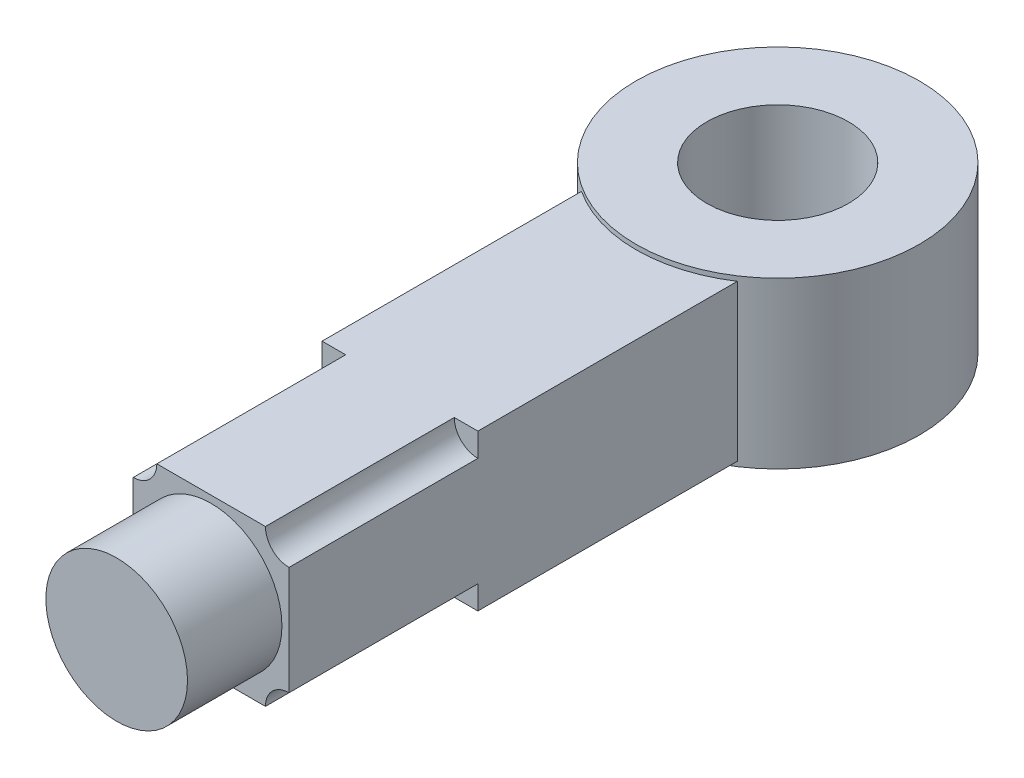
ISO-10303-21;
HEADER;
FILE_DESCRIPTION(('STEP AP214'),'2;1');
FILE_NAME('part.step','',(''),(''),'','','');
FILE_SCHEMA(('AUTOMOTIVE_DESIGN { 1 0 10303 214 1 1 1 1 }'));
ENDSEC;
DATA;
#1=APPLICATION_CONTEXT('core data for automotive mechanical design processes');
#2=APPLICATION_PROTOCOL_DEFINITION('international standard','automotive_design',2000,#1);
#3=PRODUCT_CONTEXT('',#1,'mechanical');
#4=PRODUCT('Part','Part','',(#3));
#5=PRODUCT_RELATED_PRODUCT_CATEGORY('part','',(#4));
#6=PRODUCT_DEFINITION_FORMATION('','',#4);
#7=PRODUCT_DEFINITION_CONTEXT('part definition',#1,'design');
#8=PRODUCT_DEFINITION('design','',#6,#7);
#9=PRODUCT_DEFINITION_SHAPE('','',#8);
#10=(LENGTH_UNIT() NAMED_UNIT(*) SI_UNIT(.MILLI.,.METRE.));
#11=(NAMED_UNIT(*) PLANE_ANGLE_UNIT() SI_UNIT($,.RADIAN.));
#12=(NAMED_UNIT(*) SI_UNIT($,.STERADIAN.) SOLID_ANGLE_UNIT());
#13=UNCERTAINTY_MEASURE_WITH_UNIT(LENGTH_MEASURE(1.E-05),#10,'distance_accuracy_value','');
#14=(GEOMETRIC_REPRESENTATION_CONTEXT(3) GLOBAL_UNCERTAINTY_ASSIGNED_CONTEXT((#13)) GLOBAL_UNIT_ASSIGNED_CONTEXT((#10,
#11,#12)) REPRESENTATION_CONTEXT('',''));
#15=CARTESIAN_POINT('',(0.,0.,0.));
#16=DIRECTION('',(0.,0.,1.));
#17=DIRECTION('',(1.,0.,0.));
#18=AXIS2_PLACEMENT_3D('',#15,#16,#17);
#19=CARTESIAN_POINT('',(16.5,16.5,120.));
#20=DIRECTION('',(-1.,0.,0.));
#21=DIRECTION('',(0.,0.,1.));
#22=AXIS2_PLACEMENT_3D('',#19,#20,#21);
#23=PLANE('',#22);
#24=DIRECTION('',(0.,0.,-1.));
#25=VECTOR('',#24,1.);
#26=CARTESIAN_POINT('',(16.5,-11.5000000000001,140.));
#27=LINE('',#26,#25);
#28=CARTESIAN_POINT('',(16.5,-11.5000000000001,120.));
#29=VERTEX_POINT('',#28);
#30=CARTESIAN_POINT('',(16.5,-11.5000000000001,80.));
#31=VERTEX_POINT('',#30);
#32=EDGE_CURVE('E136',#29,#31,#27,.T.);
#33=ORIENTED_EDGE('',*,*,#32,.T.);
#34=DIRECTION('',(0.,1.,0.));
#35=VECTOR('',#34,1.);
#36=CARTESIAN_POINT('',(16.4999999999999,-16.5000000000001,80.));
#37=LINE('',#36,#35);
#38=CARTESIAN_POINT('',(16.4999999999999,-16.5000000000001,80.));
#39=VERTEX_POINT('',#38);
#40=EDGE_CURVE('E142',#39,#31,#37,.T.);
#41=ORIENTED_EDGE('',*,*,#40,.F.);
#42=DIRECTION('',(0.,0.,-1.));
#43=VECTOR('',#42,1.);
#44=CARTESIAN_POINT('',(16.5,-16.5,120.));
#45=LINE('',#44,#43);
#46=CARTESIAN_POINT('',(16.5,-16.5,25.0549396327351));
#47=VERTEX_POINT('',#46);
#48=EDGE_CURVE('E237',#39,#47,#45,.T.);
#49=ORIENTED_EDGE('',*,*,#48,.T.);
#50=DIRECTION('',(0.,-1.,0.));
#51=VECTOR('',#50,1.);
#52=CARTESIAN_POINT('',(16.5,17.5,25.0549396327351));
#53=LINE('',#52,#51);
#54=CARTESIAN_POINT('',(16.5,16.5,25.0549396327351));
#55=VERTEX_POINT('',#54);
#56=EDGE_CURVE('E222',#47,#55,#53,.F.);
#57=ORIENTED_EDGE('',*,*,#56,.T.);
#58=DIRECTION('',(0.,0.,-1.));
#59=VECTOR('',#58,1.);
#60=CARTESIAN_POINT('',(16.5,16.5,120.));
#61=LINE('',#60,#59);
#62=CARTESIAN_POINT('',(16.5,16.5,80.));
#63=VERTEX_POINT('',#62);
#64=EDGE_CURVE('E246',#63,#55,#61,.T.);
#65=ORIENTED_EDGE('',*,*,#64,.F.);
#66=DIRECTION('',(0.,1.,0.));
#67=VECTOR('',#66,1.);
#68=CARTESIAN_POINT('',(16.5,11.5,80.));
#69=LINE('',#68,#67);
#70=CARTESIAN_POINT('',(16.5,11.5,80.));
#71=VERTEX_POINT('',#70);
#72=EDGE_CURVE('E203',#71,#63,#69,.T.);
#73=ORIENTED_EDGE('',*,*,#72,.F.);
#74=DIRECTION('',(0.,0.,-1.));
#75=VECTOR('',#74,1.);
#76=CARTESIAN_POINT('',(16.5,11.5,140.));
#77=LINE('',#76,#75);
#78=CARTESIAN_POINT('',(16.5,11.5,120.));
#79=VERTEX_POINT('',#78);
#80=EDGE_CURVE('E206',#79,#71,#77,.T.);
#81=ORIENTED_EDGE('',*,*,#80,.F.);
#82=DIRECTION('',(0.,1.,0.));
#83=VECTOR('',#82,1.);
#84=CARTESIAN_POINT('',(16.5,16.5,120.));
#85=LINE('',#84,#83);
#86=EDGE_CURVE('E153',#29,#79,#85,.T.);
#87=ORIENTED_EDGE('',*,*,#86,.F.);
#88=EDGE_LOOP('',(#33,#41,#49,#57,#65,#73,#81,#87));
#89=FACE_BOUND('',#88,.T.);
#90=ADVANCED_FACE('F45',(#89),#23,.F.);
#91=CARTESIAN_POINT('',(-16.5,16.5,120.));
#92=DIRECTION('',(0.,-1.,0.));
#93=DIRECTION('',(0.,0.,-1.));
#94=AXIS2_PLACEMENT_3D('',#91,#92,#93);
#95=PLANE('',#94);
#96=DIRECTION('',(0.,0.,-1.));
#97=VECTOR('',#96,1.);
#98=CARTESIAN_POINT('',(-11.4999999999998,16.5000000000001,140.));
#99=LINE('',#98,#97);
#100=CARTESIAN_POINT('',(-11.4999999999998,16.5000000000001,120.));
#101=VERTEX_POINT('',#100);
#102=CARTESIAN_POINT('',(-11.4999999999998,16.5000000000001,80.));
#103=VERTEX_POINT('',#102);
#104=EDGE_CURVE('E169',#101,#103,#99,.T.);
#105=ORIENTED_EDGE('',*,*,#104,.F.);
#106=DIRECTION('',(-1.,0.,0.));
#107=VECTOR('',#106,1.);
#108=CARTESIAN_POINT('',(-16.5,16.5,120.));
#109=LINE('',#108,#107);
#110=CARTESIAN_POINT('',(11.5,16.5,120.));
#111=VERTEX_POINT('',#110);
#112=EDGE_CURVE('E225',#111,#101,#109,.T.);
#113=ORIENTED_EDGE('',*,*,#112,.F.);
#114=DIRECTION('',(0.,0.,-1.));
#115=VECTOR('',#114,1.);
#116=CARTESIAN_POINT('',(11.5,16.5,140.));
#117=LINE('',#116,#115);
#118=CARTESIAN_POINT('',(11.5,16.5,80.));
#119=VERTEX_POINT('',#118);
#120=EDGE_CURVE('E209',#111,#119,#117,.T.);
#121=ORIENTED_EDGE('',*,*,#120,.T.);
#122=DIRECTION('',(-1.,0.,0.));
#123=VECTOR('',#122,1.);
#124=CARTESIAN_POINT('',(16.5,16.5,80.));
#125=LINE('',#124,#123);
#126=EDGE_CURVE('E195',#63,#119,#125,.T.);
#127=ORIENTED_EDGE('',*,*,#126,.F.);
#128=ORIENTED_EDGE('',*,*,#64,.T.);
#129=CARTESIAN_POINT('',(0.,16.5,0.));
#130=DIRECTION('',(0.,-1.,0.));
#131=DIRECTION('',(0.,0.,-1.));
#132=AXIS2_PLACEMENT_3D('',#129,#130,#131);
#133=CIRCLE('',#132,30.);
#134=CARTESIAN_POINT('',(-16.5,16.5,25.0549396327351));
#135=VERTEX_POINT('',#134);
#136=EDGE_CURVE('E265',#55,#135,#133,.T.);
#137=ORIENTED_EDGE('',*,*,#136,.T.);
#138=DIRECTION('',(0.,0.,-1.));
#139=VECTOR('',#138,1.);
#140=CARTESIAN_POINT('',(-16.5,16.5,120.));
#141=LINE('',#140,#139);
#142=CARTESIAN_POINT('',(-16.5,16.5,80.));
#143=VERTEX_POINT('',#142);
#144=EDGE_CURVE('E243',#143,#135,#141,.T.);
#145=ORIENTED_EDGE('',*,*,#144,.F.);
#146=DIRECTION('',(-1.,0.,0.));
#147=VECTOR('',#146,1.);
#148=CARTESIAN_POINT('',(-11.4999999999998,16.5000000000001,80.));
#149=LINE('',#148,#147);
#150=EDGE_CURVE('E61',#103,#143,#149,.T.);
#151=ORIENTED_EDGE('',*,*,#150,.F.);
#152=EDGE_LOOP('',(#105,#113,#121,#127,#128,#137,#145,#151));
#153=FACE_BOUND('',#152,.T.);
#154=ADVANCED_FACE('F298',(#153),#95,.F.);
#155=CARTESIAN_POINT('',(0.,0.,120.));
#156=DIRECTION('',(0.,0.,1.));
#157=DIRECTION('',(1.,0.,0.));
#158=AXIS2_PLACEMENT_3D('',#155,#156,#157);
#159=PLANE('',#158);
#160=CARTESIAN_POINT('',(0.,0.,120.));
#161=DIRECTION('',(0.,0.,1.));
#162=DIRECTION('',(1.,0.,0.));
#163=AXIS2_PLACEMENT_3D('',#160,#161,#162);
#164=CIRCLE('',#163,15.);
#165=CARTESIAN_POINT('',(15.,0.,120.));
#166=VERTEX_POINT('',#165);
#167=EDGE_CURVE('E217',#166,#166,#164,.T.);
#168=ORIENTED_EDGE('',*,*,#167,.F.);
#169=EDGE_LOOP('',(#168));
#170=FACE_BOUND('',#169,.T.);
#171=DIRECTION('',(1.,0.,0.));
#172=VECTOR('',#171,1.);
#173=CARTESIAN_POINT('',(-16.5,-16.5,120.));
#174=LINE('',#173,#172);
#175=CARTESIAN_POINT('',(-11.5,-16.5,120.));
#176=VERTEX_POINT('',#175);
#177=CARTESIAN_POINT('',(11.4999999999999,-16.5,120.));
#178=VERTEX_POINT('',#177);
#179=EDGE_CURVE('E233',#176,#178,#174,.T.);
#180=ORIENTED_EDGE('',*,*,#179,.T.);
#181=CARTESIAN_POINT('',(16.4999999999999,-16.5000000000001,120.));
#182=DIRECTION('',(0.,0.,1.));
#183=DIRECTION('',(1.,0.,0.));
#184=AXIS2_PLACEMENT_3D('',#181,#182,#183);
#185=CIRCLE('',#184,5.);
#186=EDGE_CURVE('E160',#178,#29,#185,.F.);
#187=ORIENTED_EDGE('',*,*,#186,.T.);
#188=ORIENTED_EDGE('',*,*,#86,.T.);
#189=CARTESIAN_POINT('',(16.5,16.5,120.));
#190=DIRECTION('',(0.,0.,1.));
#191=DIRECTION('',(1.,0.,0.));
#192=AXIS2_PLACEMENT_3D('',#189,#190,#191);
#193=CIRCLE('',#192,5.);
#194=EDGE_CURVE('E221',#79,#111,#193,.F.);
#195=ORIENTED_EDGE('',*,*,#194,.T.);
#196=ORIENTED_EDGE('',*,*,#112,.T.);
#197=CARTESIAN_POINT('',(-16.4999999999998,16.5000000000002,120.));
#198=DIRECTION('',(0.,0.,1.));
#199=DIRECTION('',(1.,0.,0.));
#200=AXIS2_PLACEMENT_3D('',#197,#198,#199);
#201=CIRCLE('',#200,5.);
#202=CARTESIAN_POINT('',(-16.4999999999999,11.5000000000002,120.));
#203=VERTEX_POINT('',#202);
#204=EDGE_CURVE('E191',#101,#203,#201,.F.);
#205=ORIENTED_EDGE('',*,*,#204,.T.);
#206=DIRECTION('',(0.,-1.,0.));
#207=VECTOR('',#206,1.);
#208=CARTESIAN_POINT('',(-16.5,16.5,120.));
#209=LINE('',#208,#207);
#210=CARTESIAN_POINT('',(-16.5,-11.5,120.));
#211=VERTEX_POINT('',#210);
#212=EDGE_CURVE('E229',#203,#211,#209,.T.);
#213=ORIENTED_EDGE('',*,*,#212,.T.);
#214=CARTESIAN_POINT('',(-16.5,-16.5,120.));
#215=DIRECTION('',(0.,0.,1.));
#216=DIRECTION('',(1.,0.,0.));
#217=AXIS2_PLACEMENT_3D('',#214,#215,#216);
#218=CIRCLE('',#217,5.);
#219=EDGE_CURVE('E155',#211,#176,#218,.F.);
#220=ORIENTED_EDGE('',*,*,#219,.T.);
#221=EDGE_LOOP('',(#180,#187,#188,#195,#196,#205,#213,#220));
#222=FACE_BOUND('',#221,.T.);
#223=ADVANCED_FACE('F286',(#170,#222),#159,.T.);
#224=CARTESIAN_POINT('',(-16.5,16.5,120.));
#225=DIRECTION('',(1.,0.,0.));
#226=DIRECTION('',(0.,0.,-1.));
#227=AXIS2_PLACEMENT_3D('',#224,#225,#226);
#228=PLANE('',#227);
#229=DIRECTION('',(0.,0.,-1.));
#230=VECTOR('',#229,1.);
#231=CARTESIAN_POINT('',(-16.5,-11.5,140.));
#232=LINE('',#231,#230);
#233=CARTESIAN_POINT('',(-16.5,-11.5,80.));
#234=VERTEX_POINT('',#233);
#235=EDGE_CURVE('E149',#211,#234,#232,.T.);
#236=ORIENTED_EDGE('',*,*,#235,.F.);
#237=ORIENTED_EDGE('',*,*,#212,.F.);
#238=DIRECTION('',(0.,0.,-1.));
#239=VECTOR('',#238,1.);
#240=CARTESIAN_POINT('',(-16.5,11.5000000000002,140.));
#241=LINE('',#240,#239);
#242=CARTESIAN_POINT('',(-16.4999999999999,11.5000000000002,80.));
#243=VERTEX_POINT('',#242);
#244=EDGE_CURVE('E11',#243,#203,#241,.F.);
#245=ORIENTED_EDGE('',*,*,#244,.F.);
#246=DIRECTION('',(0.,-1.,0.));
#247=VECTOR('',#246,1.);
#248=CARTESIAN_POINT('',(-16.4999999999998,16.5000000000002,80.));
#249=LINE('',#248,#247);
#250=EDGE_CURVE('E178',#143,#243,#249,.T.);
#251=ORIENTED_EDGE('',*,*,#250,.F.);
#252=ORIENTED_EDGE('',*,*,#144,.T.);
#253=DIRECTION('',(0.,-1.,0.));
#254=VECTOR('',#253,1.);
#255=CARTESIAN_POINT('',(-16.5,17.5,25.0549396327351));
#256=LINE('',#255,#254);
#257=CARTESIAN_POINT('',(-16.5,-16.5,25.0549396327351));
#258=VERTEX_POINT('',#257);
#259=EDGE_CURVE('E261',#135,#258,#256,.T.);
#260=ORIENTED_EDGE('',*,*,#259,.T.);
#261=DIRECTION('',(0.,0.,-1.));
#262=VECTOR('',#261,1.);
#263=CARTESIAN_POINT('',(-16.5,-16.5,120.));
#264=LINE('',#263,#262);
#265=CARTESIAN_POINT('',(-16.5,-16.5,80.));
#266=VERTEX_POINT('',#265);
#267=EDGE_CURVE('E240',#266,#258,#264,.T.);
#268=ORIENTED_EDGE('',*,*,#267,.F.);
#269=DIRECTION('',(0.,-1.,0.));
#270=VECTOR('',#269,1.);
#271=CARTESIAN_POINT('',(-16.5,-11.5,80.));
#272=LINE('',#271,#270);
#273=EDGE_CURVE('E173',#234,#266,#272,.T.);
#274=ORIENTED_EDGE('',*,*,#273,.F.);
#275=EDGE_LOOP('',(#236,#237,#245,#251,#252,#260,#268,#274));
#276=FACE_BOUND('',#275,.T.);
#277=ADVANCED_FACE('F312',(#276),#228,.F.);
#278=CARTESIAN_POINT('',(-16.5,-16.5,120.));
#279=DIRECTION('',(0.,1.,0.));
#280=DIRECTION('',(0.,0.,1.));
#281=AXIS2_PLACEMENT_3D('',#278,#279,#280);
#282=PLANE('',#281);
#283=DIRECTION('',(0.,0.,-1.));
#284=VECTOR('',#283,1.);
#285=CARTESIAN_POINT('',(11.4999999999999,-16.5,140.));
#286=LINE('',#285,#284);
#287=CARTESIAN_POINT('',(11.4999999999999,-16.5,80.));
#288=VERTEX_POINT('',#287);
#289=EDGE_CURVE('E54',#178,#288,#286,.T.);
#290=ORIENTED_EDGE('',*,*,#289,.F.);
#291=ORIENTED_EDGE('',*,*,#179,.F.);
#292=DIRECTION('',(0.,0.,-1.));
#293=VECTOR('',#292,1.);
#294=CARTESIAN_POINT('',(-11.5,-16.5,140.));
#295=LINE('',#294,#293);
#296=CARTESIAN_POINT('',(-11.5,-16.5,80.));
#297=VERTEX_POINT('',#296);
#298=EDGE_CURVE('E275',#297,#176,#295,.F.);
#299=ORIENTED_EDGE('',*,*,#298,.F.);
#300=DIRECTION('',(1.,0.,0.));
#301=VECTOR('',#300,1.);
#302=CARTESIAN_POINT('',(-16.5,-16.5,80.));
#303=LINE('',#302,#301);
#304=EDGE_CURVE('E164',#266,#297,#303,.T.);
#305=ORIENTED_EDGE('',*,*,#304,.F.);
#306=ORIENTED_EDGE('',*,*,#267,.T.);
#307=CARTESIAN_POINT('',(0.,-16.5,0.));
#308=DIRECTION('',(0.,1.,0.));
#309=DIRECTION('',(0.,0.,1.));
#310=AXIS2_PLACEMENT_3D('',#307,#308,#309);
#311=CIRCLE('',#310,30.);
#312=EDGE_CURVE('E254',#258,#47,#311,.T.);
#313=ORIENTED_EDGE('',*,*,#312,.T.);
#314=ORIENTED_EDGE('',*,*,#48,.F.);
#315=DIRECTION('',(1.,0.,0.));
#316=VECTOR('',#315,1.);
#317=CARTESIAN_POINT('',(11.4999999999999,-16.5,80.));
#318=LINE('',#317,#316);
#319=EDGE_CURVE('E141',#288,#39,#318,.T.);
#320=ORIENTED_EDGE('',*,*,#319,.F.);
#321=EDGE_LOOP('',(#290,#291,#299,#305,#306,#313,#314,#320));
#322=FACE_BOUND('',#321,.T.);
#323=ADVANCED_FACE('F288',(#322),#282,.F.);
#324=CARTESIAN_POINT('',(0.,17.5,0.));
#325=DIRECTION('',(0.,-1.,0.));
#326=DIRECTION('',(0.,0.,-1.));
#327=AXIS2_PLACEMENT_3D('',#324,#325,#326);
#328=CYLINDRICAL_SURFACE('',#327,30.);
#329=CARTESIAN_POINT('',(0.,-17.5,0.));
#330=DIRECTION('',(0.,1.,0.));
#331=DIRECTION('',(0.,0.,1.));
#332=AXIS2_PLACEMENT_3D('',#329,#330,#331);
#333=CIRCLE('',#332,30.);
#334=CARTESIAN_POINT('',(0.,-17.5,30.));
#335=VERTEX_POINT('',#334);
#336=EDGE_CURVE('E249',#335,#335,#333,.T.);
#337=ORIENTED_EDGE('',*,*,#336,.T.);
#338=EDGE_LOOP('',(#337));
#339=FACE_BOUND('',#338,.T.);
#340=CARTESIAN_POINT('',(0.,17.5,0.));
#341=DIRECTION('',(0.,1.,0.));
#342=DIRECTION('',(0.,0.,1.));
#343=AXIS2_PLACEMENT_3D('',#340,#341,#342);
#344=CIRCLE('',#343,30.);
#345=CARTESIAN_POINT('',(0.,17.5,30.));
#346=VERTEX_POINT('',#345);
#347=EDGE_CURVE('E250',#346,#346,#344,.T.);
#348=ORIENTED_EDGE('',*,*,#347,.F.);
#349=EDGE_LOOP('',(#348));
#350=FACE_BOUND('',#349,.T.);
#351=ORIENTED_EDGE('',*,*,#56,.F.);
#352=ORIENTED_EDGE('',*,*,#312,.F.);
#353=ORIENTED_EDGE('',*,*,#259,.F.);
#354=ORIENTED_EDGE('',*,*,#136,.F.);
#355=EDGE_LOOP('',(#351,#352,#353,#354));
#356=FACE_BOUND('',#355,.T.);
#357=ADVANCED_FACE('F47',(#339,#350,#356),#328,.T.);
#358=CARTESIAN_POINT('',(0.,17.5,0.));
#359=DIRECTION('',(0.,1.,0.));
#360=DIRECTION('',(0.,0.,1.));
#361=AXIS2_PLACEMENT_3D('',#358,#359,#360);
#362=PLANE('',#361);
#363=CARTESIAN_POINT('',(0.,17.5,0.));
#364=DIRECTION('',(0.,1.,0.));
#365=DIRECTION('',(0.,0.,1.));
#366=AXIS2_PLACEMENT_3D('',#363,#364,#365);
#367=CIRCLE('',#366,15.);
#368=CARTESIAN_POINT('',(0.,17.5,15.));
#369=VERTEX_POINT('',#368);
#370=EDGE_CURVE('E489',#369,#369,#367,.T.);
#371=ORIENTED_EDGE('',*,*,#370,.F.);
#372=EDGE_LOOP('',(#371));
#373=FACE_BOUND('',#372,.T.);
#374=ORIENTED_EDGE('',*,*,#347,.T.);
#375=EDGE_LOOP('',(#374));
#376=FACE_BOUND('',#375,.T.);
#377=ADVANCED_FACE('F334',(#373,#376),#362,.T.);
#378=CARTESIAN_POINT('',(0.,-17.5,0.));
#379=DIRECTION('',(0.,1.,0.));
#380=DIRECTION('',(0.,0.,1.));
#381=AXIS2_PLACEMENT_3D('',#378,#379,#380);
#382=PLANE('',#381);
#383=CARTESIAN_POINT('',(0.,-17.5,0.));
#384=DIRECTION('',(0.,1.,0.));
#385=DIRECTION('',(0.,0.,1.));
#386=AXIS2_PLACEMENT_3D('',#383,#384,#385);
#387=CIRCLE('',#386,15.);
#388=CARTESIAN_POINT('',(0.,-17.5,15.));
#389=VERTEX_POINT('',#388);
#390=EDGE_CURVE('E182',#389,#389,#387,.T.);
#391=ORIENTED_EDGE('',*,*,#390,.T.);
#392=EDGE_LOOP('',(#391));
#393=FACE_BOUND('',#392,.T.);
#394=ORIENTED_EDGE('',*,*,#336,.F.);
#395=EDGE_LOOP('',(#394));
#396=FACE_BOUND('',#395,.T.);
#397=ADVANCED_FACE('F336',(#393,#396),#382,.F.);
#398=CARTESIAN_POINT('',(0.,0.,140.));
#399=DIRECTION('',(0.,0.,-1.));
#400=DIRECTION('',(-1.,0.,0.));
#401=AXIS2_PLACEMENT_3D('',#398,#399,#400);
#402=CYLINDRICAL_SURFACE('',#401,15.);
#403=CARTESIAN_POINT('',(0.,0.,140.));
#404=DIRECTION('',(0.,0.,1.));
#405=DIRECTION('',(1.,0.,0.));
#406=AXIS2_PLACEMENT_3D('',#403,#404,#405);
#407=CIRCLE('',#406,15.);
#408=CARTESIAN_POINT('',(15.,0.,140.));
#409=VERTEX_POINT('',#408);
#410=EDGE_CURVE('E213',#409,#409,#407,.T.);
#411=ORIENTED_EDGE('',*,*,#410,.F.);
#412=EDGE_LOOP('',(#411));
#413=FACE_BOUND('',#412,.T.);
#414=ORIENTED_EDGE('',*,*,#167,.T.);
#415=EDGE_LOOP('',(#414));
#416=FACE_BOUND('',#415,.T.);
#417=ADVANCED_FACE('F339',(#413,#416),#402,.T.);
#418=CARTESIAN_POINT('',(0.,0.,140.));
#419=DIRECTION('',(0.,0.,1.));
#420=DIRECTION('',(1.,0.,0.));
#421=AXIS2_PLACEMENT_3D('',#418,#419,#420);
#422=PLANE('',#421);
#423=ORIENTED_EDGE('',*,*,#410,.T.);
#424=EDGE_LOOP('',(#423));
#425=FACE_BOUND('',#424,.T.);
#426=ADVANCED_FACE('F345',(#425),#422,.T.);
#427=CARTESIAN_POINT('',(16.5,16.5,140.));
#428=DIRECTION('',(0.,0.,-1.));
#429=DIRECTION('',(-1.,0.,0.));
#430=AXIS2_PLACEMENT_3D('',#427,#428,#429);
#431=CYLINDRICAL_SURFACE('',#430,5.);
#432=ORIENTED_EDGE('',*,*,#80,.T.);
#433=CARTESIAN_POINT('',(16.5,16.5,80.));
#434=DIRECTION('',(0.,0.,1.));
#435=DIRECTION('',(1.,0.,0.));
#436=AXIS2_PLACEMENT_3D('',#433,#434,#435);
#437=CIRCLE('',#436,5.);
#438=EDGE_CURVE('E199',#119,#71,#437,.T.);
#439=ORIENTED_EDGE('',*,*,#438,.F.);
#440=ORIENTED_EDGE('',*,*,#120,.F.);
#441=ORIENTED_EDGE('',*,*,#194,.F.);
#442=EDGE_LOOP('',(#432,#439,#440,#441));
#443=FACE_BOUND('',#442,.T.);
#444=ADVANCED_FACE('F304',(#443),#431,.F.);
#445=CARTESIAN_POINT('',(16.5,16.5,80.));
#446=DIRECTION('',(0.,0.,1.));
#447=DIRECTION('',(1.,0.,0.));
#448=AXIS2_PLACEMENT_3D('',#445,#446,#447);
#449=PLANE('',#448);
#450=ORIENTED_EDGE('',*,*,#126,.T.);
#451=ORIENTED_EDGE('',*,*,#438,.T.);
#452=ORIENTED_EDGE('',*,*,#72,.T.);
#453=EDGE_LOOP('',(#450,#451,#452));
#454=FACE_BOUND('',#453,.T.);
#455=ADVANCED_FACE('F302',(#454),#449,.T.);
#456=CARTESIAN_POINT('',(-16.5,-16.5,140.));
#457=DIRECTION('',(0.,0.,-1.));
#458=DIRECTION('',(-1.,0.,0.));
#459=AXIS2_PLACEMENT_3D('',#456,#457,#458);
#460=CYLINDRICAL_SURFACE('',#459,5.);
#461=ORIENTED_EDGE('',*,*,#235,.T.);
#462=CARTESIAN_POINT('',(-16.5,-16.5,80.));
#463=DIRECTION('',(0.,0.,1.));
#464=DIRECTION('',(-1.,0.,0.));
#465=AXIS2_PLACEMENT_3D('',#462,#463,#464);
#466=CIRCLE('',#465,5.);
#467=EDGE_CURVE('E168',#297,#234,#466,.T.);
#468=ORIENTED_EDGE('',*,*,#467,.F.);
#469=ORIENTED_EDGE('',*,*,#298,.T.);
#470=ORIENTED_EDGE('',*,*,#219,.F.);
#471=EDGE_LOOP('',(#461,#468,#469,#470));
#472=FACE_BOUND('',#471,.T.);
#473=ADVANCED_FACE('F280',(#472),#460,.F.);
#474=CARTESIAN_POINT('',(-16.5,-16.5,80.));
#475=DIRECTION('',(0.,0.,1.));
#476=DIRECTION('',(-1.,0.,0.));
#477=AXIS2_PLACEMENT_3D('',#474,#475,#476);
#478=PLANE('',#477);
#479=ORIENTED_EDGE('',*,*,#304,.T.);
#480=ORIENTED_EDGE('',*,*,#467,.T.);
#481=ORIENTED_EDGE('',*,*,#273,.T.);
#482=EDGE_LOOP('',(#479,#480,#481));
#483=FACE_BOUND('',#482,.T.);
#484=ADVANCED_FACE('F316',(#483),#478,.T.);
#485=CARTESIAN_POINT('',(16.4999999999999,-16.5000000000001,140.));
#486=DIRECTION('',(0.,0.,-1.));
#487=DIRECTION('',(-1.,0.,0.));
#488=AXIS2_PLACEMENT_3D('',#485,#486,#487);
#489=CYLINDRICAL_SURFACE('',#488,5.);
#490=ORIENTED_EDGE('',*,*,#289,.T.);
#491=CARTESIAN_POINT('',(16.4999999999999,-16.5000000000001,80.));
#492=DIRECTION('',(0.,0.,1.));
#493=DIRECTION('',(0.,-1.,0.));
#494=AXIS2_PLACEMENT_3D('',#491,#492,#493);
#495=CIRCLE('',#494,5.);
#496=EDGE_CURVE('E69',#31,#288,#495,.T.);
#497=ORIENTED_EDGE('',*,*,#496,.F.);
#498=ORIENTED_EDGE('',*,*,#32,.F.);
#499=ORIENTED_EDGE('',*,*,#186,.F.);
#500=EDGE_LOOP('',(#490,#497,#498,#499));
#501=FACE_BOUND('',#500,.T.);
#502=ADVANCED_FACE('F134',(#501),#489,.F.);
#503=CARTESIAN_POINT('',(16.4999999999999,-16.5000000000001,80.));
#504=DIRECTION('',(0.,0.,1.));
#505=DIRECTION('',(0.,-1.,0.));
#506=AXIS2_PLACEMENT_3D('',#503,#504,#505);
#507=PLANE('',#506);
#508=ORIENTED_EDGE('',*,*,#40,.T.);
#509=ORIENTED_EDGE('',*,*,#496,.T.);
#510=ORIENTED_EDGE('',*,*,#319,.T.);
#511=EDGE_LOOP('',(#508,#509,#510));
#512=FACE_BOUND('',#511,.T.);
#513=ADVANCED_FACE('F145',(#512),#507,.T.);
#514=CARTESIAN_POINT('',(-16.4999999999998,16.5000000000002,140.));
#515=DIRECTION('',(0.,0.,-1.));
#516=DIRECTION('',(-1.,0.,0.));
#517=AXIS2_PLACEMENT_3D('',#514,#515,#516);
#518=CYLINDRICAL_SURFACE('',#517,5.);
#519=ORIENTED_EDGE('',*,*,#104,.T.);
#520=CARTESIAN_POINT('',(-16.4999999999998,16.5000000000002,80.));
#521=DIRECTION('',(0.,0.,1.));
#522=DIRECTION('',(0.,1.,0.));
#523=AXIS2_PLACEMENT_3D('',#520,#521,#522);
#524=CIRCLE('',#523,5.);
#525=EDGE_CURVE('E181',#243,#103,#524,.T.);
#526=ORIENTED_EDGE('',*,*,#525,.F.);
#527=ORIENTED_EDGE('',*,*,#244,.T.);
#528=ORIENTED_EDGE('',*,*,#204,.F.);
#529=EDGE_LOOP('',(#519,#526,#527,#528));
#530=FACE_BOUND('',#529,.T.);
#531=ADVANCED_FACE('F308',(#530),#518,.F.);
#532=CARTESIAN_POINT('',(-16.4999999999998,16.5000000000002,80.));
#533=DIRECTION('',(0.,0.,1.));
#534=DIRECTION('',(0.,1.,0.));
#535=AXIS2_PLACEMENT_3D('',#532,#533,#534);
#536=PLANE('',#535);
#537=ORIENTED_EDGE('',*,*,#250,.T.);
#538=ORIENTED_EDGE('',*,*,#525,.T.);
#539=ORIENTED_EDGE('',*,*,#150,.T.);
#540=EDGE_LOOP('',(#537,#538,#539));
#541=FACE_BOUND('',#540,.T.);
#542=ADVANCED_FACE('F309',(#541),#536,.T.);
#543=CARTESIAN_POINT('',(0.,17.5,0.));
#544=DIRECTION('',(0.,1.,0.));
#545=DIRECTION('',(0.,0.,1.));
#546=AXIS2_PLACEMENT_3D('',#543,#544,#545);
#547=CYLINDRICAL_SURFACE('',#546,15.);
#548=ORIENTED_EDGE('',*,*,#390,.F.);
#549=EDGE_LOOP('',(#548));
#550=FACE_BOUND('',#549,.T.);
#551=ORIENTED_EDGE('',*,*,#370,.T.);
#552=EDGE_LOOP('',(#551));
#553=FACE_BOUND('',#552,.T.);
#554=ADVANCED_FACE('F377',(#550,#553),#547,.F.);
#555=CLOSED_SHELL('',(#90,#154,#223,#277,#323,#357,#377,#397,#417,#426,#444,#455,#473,#484,#502,
#513,#531,#542,#554));
#556=MANIFOLD_SOLID_BREP('B2',#555);
#557=ADVANCED_BREP_SHAPE_REPRESENTATION('',(#18,#556),#14);
#558=SHAPE_DEFINITION_REPRESENTATION(#9,#557);
ENDSEC;
END-ISO-10303-21;
